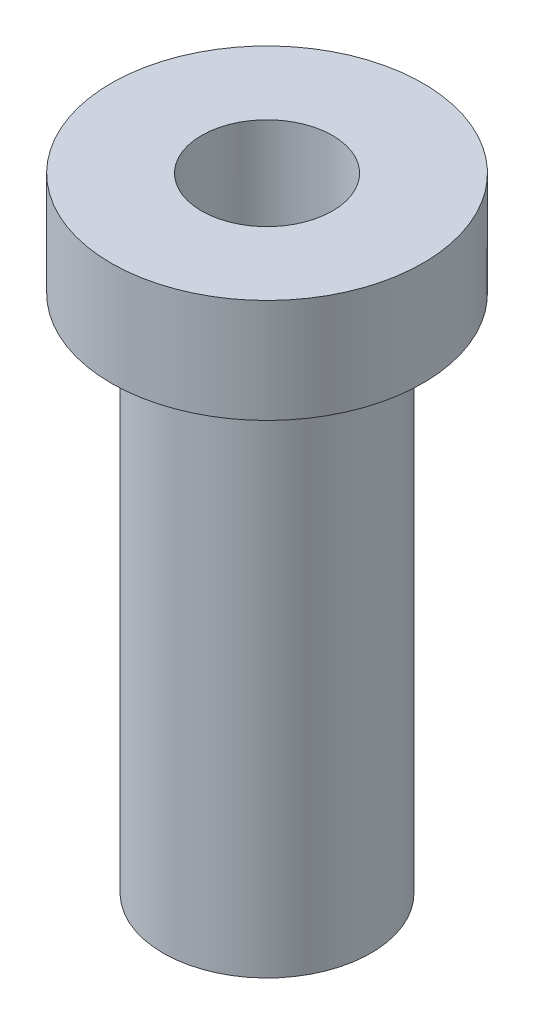
ISO-10303-21;
HEADER;
FILE_DESCRIPTION(('STEP AP214'),'2;1');
FILE_NAME('part.step','',(''),(''),'','','');
FILE_SCHEMA(('AUTOMOTIVE_DESIGN { 1 0 10303 214 1 1 1 1 }'));
ENDSEC;
DATA;
#1=APPLICATION_CONTEXT('core data for automotive mechanical design processes');
#2=APPLICATION_PROTOCOL_DEFINITION('international standard','automotive_design',2000,#1);
#3=PRODUCT_CONTEXT('',#1,'mechanical');
#4=PRODUCT('Part','Part','',(#3));
#5=PRODUCT_RELATED_PRODUCT_CATEGORY('part','',(#4));
#6=PRODUCT_DEFINITION_FORMATION('','',#4);
#7=PRODUCT_DEFINITION_CONTEXT('part definition',#1,'design');
#8=PRODUCT_DEFINITION('design','',#6,#7);
#9=PRODUCT_DEFINITION_SHAPE('','',#8);
#10=(LENGTH_UNIT() NAMED_UNIT(*) SI_UNIT(.MILLI.,.METRE.));
#11=(NAMED_UNIT(*) PLANE_ANGLE_UNIT() SI_UNIT($,.RADIAN.));
#12=(NAMED_UNIT(*) SI_UNIT($,.STERADIAN.) SOLID_ANGLE_UNIT());
#13=UNCERTAINTY_MEASURE_WITH_UNIT(LENGTH_MEASURE(1.E-05),#10,'distance_accuracy_value','');
#14=(GEOMETRIC_REPRESENTATION_CONTEXT(3) GLOBAL_UNCERTAINTY_ASSIGNED_CONTEXT((#13)) GLOBAL_UNIT_ASSIGNED_CONTEXT((#10,
#11,#12)) REPRESENTATION_CONTEXT('',''));
#15=CARTESIAN_POINT('',(0.,0.,0.));
#16=DIRECTION('',(0.,0.,1.));
#17=DIRECTION('',(1.,0.,0.));
#18=AXIS2_PLACEMENT_3D('',#15,#16,#17);
#19=CARTESIAN_POINT('',(0.,0.,0.));
#20=DIRECTION('',(0.,1.,0.));
#21=DIRECTION('',(0.,0.,1.));
#22=AXIS2_PLACEMENT_3D('',#19,#20,#21);
#23=PLANE('',#22);
#24=CARTESIAN_POINT('',(0.,0.,0.));
#25=DIRECTION('',(0.,1.,0.));
#26=DIRECTION('',(0.,0.,1.));
#27=AXIS2_PLACEMENT_3D('',#24,#25,#26);
#28=CIRCLE('',#27,19.05);
#29=CARTESIAN_POINT('',(0.,0.,19.05));
#30=VERTEX_POINT('',#29);
#31=EDGE_CURVE('E60',#30,#30,#28,.T.);
#32=ORIENTED_EDGE('',*,*,#31,.F.);
#33=EDGE_LOOP('',(#32));
#34=FACE_BOUND('',#33,.T.);
#35=CARTESIAN_POINT('',(0.,0.,0.));
#36=DIRECTION('',(0.,1.,0.));
#37=DIRECTION('',(0.,0.,1.));
#38=AXIS2_PLACEMENT_3D('',#35,#36,#37);
#39=CIRCLE('',#38,12.7);
#40=CARTESIAN_POINT('',(0.,0.,12.7));
#41=VERTEX_POINT('',#40);
#42=EDGE_CURVE('E11',#41,#41,#39,.F.);
#43=ORIENTED_EDGE('',*,*,#42,.F.);
#44=EDGE_LOOP('',(#43));
#45=FACE_BOUND('',#44,.T.);
#46=ADVANCED_FACE('F47',(#34,#45),#23,.F.);
#47=CARTESIAN_POINT('',(0.,12.7,0.));
#48=DIRECTION('',(0.,1.,0.));
#49=DIRECTION('',(0.,0.,1.));
#50=AXIS2_PLACEMENT_3D('',#47,#48,#49);
#51=PLANE('',#50);
#52=CARTESIAN_POINT('',(0.,12.7,0.));
#53=DIRECTION('',(0.,1.,0.));
#54=DIRECTION('',(0.,0.,1.));
#55=AXIS2_PLACEMENT_3D('',#52,#53,#54);
#56=CIRCLE('',#55,19.05);
#57=CARTESIAN_POINT('',(0.,12.7,19.05));
#58=VERTEX_POINT('',#57);
#59=EDGE_CURVE('E55',#58,#58,#56,.T.);
#60=ORIENTED_EDGE('',*,*,#59,.T.);
#61=EDGE_LOOP('',(#60));
#62=FACE_BOUND('',#61,.T.);
#63=CARTESIAN_POINT('',(0.,12.7,0.));
#64=DIRECTION('',(0.,1.,0.));
#65=DIRECTION('',(0.,0.,1.));
#66=AXIS2_PLACEMENT_3D('',#63,#64,#65);
#67=CIRCLE('',#66,8.001);
#68=CARTESIAN_POINT('',(0.,12.7,8.001));
#69=VERTEX_POINT('',#68);
#70=EDGE_CURVE('E66',#69,#69,#67,.T.);
#71=ORIENTED_EDGE('',*,*,#70,.F.);
#72=EDGE_LOOP('',(#71));
#73=FACE_BOUND('',#72,.T.);
#74=ADVANCED_FACE('F96',(#62,#73),#51,.T.);
#75=CARTESIAN_POINT('',(0.,12.7,0.));
#76=DIRECTION('',(0.,-1.,0.));
#77=DIRECTION('',(0.,0.,-1.));
#78=AXIS2_PLACEMENT_3D('',#75,#76,#77);
#79=CYLINDRICAL_SURFACE('',#78,19.05);
#80=ORIENTED_EDGE('',*,*,#59,.F.);
#81=EDGE_LOOP('',(#80));
#82=FACE_BOUND('',#81,.T.);
#83=ORIENTED_EDGE('',*,*,#31,.T.);
#84=EDGE_LOOP('',(#83));
#85=FACE_BOUND('',#84,.T.);
#86=ADVANCED_FACE('F49',(#82,#85),#79,.T.);
#87=CARTESIAN_POINT('',(0.,12.7,0.));
#88=DIRECTION('',(0.,-1.,0.));
#89=DIRECTION('',(0.,0.,-1.));
#90=AXIS2_PLACEMENT_3D('',#87,#88,#89);
#91=CYLINDRICAL_SURFACE('',#90,8.001);
#92=ORIENTED_EDGE('',*,*,#70,.T.);
#93=EDGE_LOOP('',(#92));
#94=FACE_BOUND('',#93,.T.);
#95=CARTESIAN_POINT('',(0.,-63.5,0.));
#96=DIRECTION('',(0.,-1.,0.));
#97=DIRECTION('',(0.,0.,-1.));
#98=AXIS2_PLACEMENT_3D('',#95,#96,#97);
#99=CIRCLE('',#98,8.001);
#100=CARTESIAN_POINT('',(0.,-63.5,-8.001));
#101=VERTEX_POINT('',#100);
#102=EDGE_CURVE('E75',#101,#101,#99,.T.);
#103=ORIENTED_EDGE('',*,*,#102,.T.);
#104=EDGE_LOOP('',(#103));
#105=FACE_BOUND('',#104,.T.);
#106=ADVANCED_FACE('F80',(#94,#105),#91,.F.);
#107=CARTESIAN_POINT('',(0.,-63.5,0.));
#108=DIRECTION('',(0.,-1.,0.));
#109=DIRECTION('',(0.,0.,-1.));
#110=AXIS2_PLACEMENT_3D('',#107,#108,#109);
#111=PLANE('',#110);
#112=CARTESIAN_POINT('',(0.,-63.5,0.));
#113=DIRECTION('',(0.,-1.,0.));
#114=DIRECTION('',(0.,0.,-1.));
#115=AXIS2_PLACEMENT_3D('',#112,#113,#114);
#116=CIRCLE('',#115,12.7);
#117=CARTESIAN_POINT('',(0.,-63.5,-12.7));
#118=VERTEX_POINT('',#117);
#119=EDGE_CURVE('E71',#118,#118,#116,.T.);
#120=ORIENTED_EDGE('',*,*,#119,.T.);
#121=EDGE_LOOP('',(#120));
#122=FACE_BOUND('',#121,.T.);
#123=ORIENTED_EDGE('',*,*,#102,.F.);
#124=EDGE_LOOP('',(#123));
#125=FACE_BOUND('',#124,.T.);
#126=ADVANCED_FACE('F82',(#122,#125),#111,.T.);
#127=CARTESIAN_POINT('',(0.,-63.5,0.));
#128=DIRECTION('',(0.,1.,0.));
#129=DIRECTION('',(0.,0.,1.));
#130=AXIS2_PLACEMENT_3D('',#127,#128,#129);
#131=CYLINDRICAL_SURFACE('',#130,12.7);
#132=ORIENTED_EDGE('',*,*,#119,.F.);
#133=EDGE_LOOP('',(#132));
#134=FACE_BOUND('',#133,.T.);
#135=ORIENTED_EDGE('',*,*,#42,.T.);
#136=EDGE_LOOP('',(#135));
#137=FACE_BOUND('',#136,.T.);
#138=ADVANCED_FACE('F84',(#134,#137),#131,.T.);
#139=CLOSED_SHELL('',(#46,#74,#86,#106,#126,#138));
#140=MANIFOLD_SOLID_BREP('B2',#139);
#141=ADVANCED_BREP_SHAPE_REPRESENTATION('',(#18,#140),#14);
#142=SHAPE_DEFINITION_REPRESENTATION(#9,#141);
ENDSEC;
END-ISO-10303-21;
